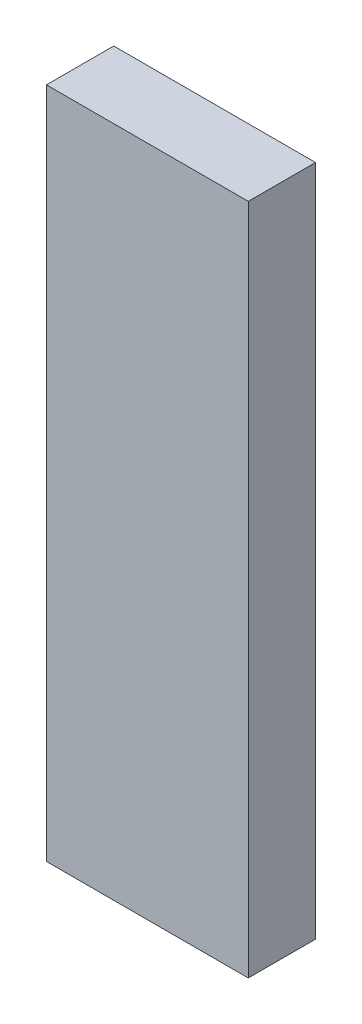
ISO-10303-21;
HEADER;
FILE_DESCRIPTION(('STEP AP214'),'2;1');
FILE_NAME('part.step','',(''),(''),'','','');
FILE_SCHEMA(('AUTOMOTIVE_DESIGN { 1 0 10303 214 1 1 1 1 }'));
ENDSEC;
DATA;
#1=APPLICATION_CONTEXT('core data for automotive mechanical design processes');
#2=APPLICATION_PROTOCOL_DEFINITION('international standard','automotive_design',2000,#1);
#3=PRODUCT_CONTEXT('',#1,'mechanical');
#4=PRODUCT('Part','Part','',(#3));
#5=PRODUCT_RELATED_PRODUCT_CATEGORY('part','',(#4));
#6=PRODUCT_DEFINITION_FORMATION('','',#4);
#7=PRODUCT_DEFINITION_CONTEXT('part definition',#1,'design');
#8=PRODUCT_DEFINITION('design','',#6,#7);
#9=PRODUCT_DEFINITION_SHAPE('','',#8);
#10=(LENGTH_UNIT() NAMED_UNIT(*) SI_UNIT(.MILLI.,.METRE.));
#11=(NAMED_UNIT(*) PLANE_ANGLE_UNIT() SI_UNIT($,.RADIAN.));
#12=(NAMED_UNIT(*) SI_UNIT($,.STERADIAN.) SOLID_ANGLE_UNIT());
#13=UNCERTAINTY_MEASURE_WITH_UNIT(LENGTH_MEASURE(1.E-05),#10,'distance_accuracy_value','');
#14=(GEOMETRIC_REPRESENTATION_CONTEXT(3) GLOBAL_UNCERTAINTY_ASSIGNED_CONTEXT((#13)) GLOBAL_UNIT_ASSIGNED_CONTEXT((#10,
#11,#12)) REPRESENTATION_CONTEXT('',''));
#15=CARTESIAN_POINT('',(0.,0.,0.));
#16=DIRECTION('',(0.,0.,1.));
#17=DIRECTION('',(1.,0.,0.));
#18=AXIS2_PLACEMENT_3D('',#15,#16,#17);
#19=CARTESIAN_POINT('',(-30.,-100.,-10.));
#20=DIRECTION('',(0.,0.,-1.));
#21=DIRECTION('',(-1.,0.,0.));
#22=AXIS2_PLACEMENT_3D('',#19,#20,#21);
#23=PLANE('',#22);
#24=DIRECTION('',(1.,0.,0.));
#25=VECTOR('',#24,1.);
#26=CARTESIAN_POINT('',(-30.,100.,-10.));
#27=LINE('',#26,#25);
#28=CARTESIAN_POINT('',(-30.,100.,-10.));
#29=VERTEX_POINT('',#28);
#30=CARTESIAN_POINT('',(30.,100.,-10.));
#31=VERTEX_POINT('',#30);
#32=EDGE_CURVE('E43',#29,#31,#27,.T.);
#33=ORIENTED_EDGE('',*,*,#32,.T.);
#34=DIRECTION('',(0.,1.,0.));
#35=VECTOR('',#34,1.);
#36=CARTESIAN_POINT('',(30.,-100.,-10.));
#37=LINE('',#36,#35);
#38=CARTESIAN_POINT('',(30.,-100.,-10.));
#39=VERTEX_POINT('',#38);
#40=EDGE_CURVE('E80',#39,#31,#37,.T.);
#41=ORIENTED_EDGE('',*,*,#40,.F.);
#42=DIRECTION('',(1.,0.,0.));
#43=VECTOR('',#42,1.);
#44=CARTESIAN_POINT('',(-30.,-100.,-10.));
#45=LINE('',#44,#43);
#46=CARTESIAN_POINT('',(-30.,-100.,-10.));
#47=VERTEX_POINT('',#46);
#48=EDGE_CURVE('E11',#47,#39,#45,.T.);
#49=ORIENTED_EDGE('',*,*,#48,.F.);
#50=DIRECTION('',(0.,1.,0.));
#51=VECTOR('',#50,1.);
#52=CARTESIAN_POINT('',(-30.,-100.,-10.));
#53=LINE('',#52,#51);
#54=EDGE_CURVE('E81',#47,#29,#53,.T.);
#55=ORIENTED_EDGE('',*,*,#54,.T.);
#56=EDGE_LOOP('',(#33,#41,#49,#55));
#57=FACE_BOUND('',#56,.T.);
#58=ADVANCED_FACE('F40',(#57),#23,.T.);
#59=CARTESIAN_POINT('',(-30.,-100.,10.));
#60=DIRECTION('',(0.,-1.,0.));
#61=DIRECTION('',(0.,0.,-1.));
#62=AXIS2_PLACEMENT_3D('',#59,#60,#61);
#63=PLANE('',#62);
#64=ORIENTED_EDGE('',*,*,#48,.T.);
#65=DIRECTION('',(0.,0.,-1.));
#66=VECTOR('',#65,1.);
#67=CARTESIAN_POINT('',(30.,-100.,10.));
#68=LINE('',#67,#66);
#69=CARTESIAN_POINT('',(30.,-100.,10.));
#70=VERTEX_POINT('',#69);
#71=EDGE_CURVE('E97',#70,#39,#68,.T.);
#72=ORIENTED_EDGE('',*,*,#71,.F.);
#73=DIRECTION('',(1.,0.,0.));
#74=VECTOR('',#73,1.);
#75=CARTESIAN_POINT('',(-30.,-100.,10.));
#76=LINE('',#75,#74);
#77=CARTESIAN_POINT('',(-30.,-100.,10.));
#78=VERTEX_POINT('',#77);
#79=EDGE_CURVE('E48',#78,#70,#76,.T.);
#80=ORIENTED_EDGE('',*,*,#79,.F.);
#81=DIRECTION('',(0.,0.,-1.));
#82=VECTOR('',#81,1.);
#83=CARTESIAN_POINT('',(-30.,-100.,10.));
#84=LINE('',#83,#82);
#85=EDGE_CURVE('E86',#78,#47,#84,.T.);
#86=ORIENTED_EDGE('',*,*,#85,.T.);
#87=EDGE_LOOP('',(#64,#72,#80,#86));
#88=FACE_BOUND('',#87,.T.);
#89=ADVANCED_FACE('F112',(#88),#63,.T.);
#90=CARTESIAN_POINT('',(-30.,-100.,10.));
#91=DIRECTION('',(0.,0.,1.));
#92=DIRECTION('',(1.,0.,0.));
#93=AXIS2_PLACEMENT_3D('',#90,#91,#92);
#94=PLANE('',#93);
#95=ORIENTED_EDGE('',*,*,#79,.T.);
#96=DIRECTION('',(0.,-1.,0.));
#97=VECTOR('',#96,1.);
#98=CARTESIAN_POINT('',(30.,-100.,10.));
#99=LINE('',#98,#97);
#100=CARTESIAN_POINT('',(30.,100.,10.));
#101=VERTEX_POINT('',#100);
#102=EDGE_CURVE('E93',#101,#70,#99,.T.);
#103=ORIENTED_EDGE('',*,*,#102,.F.);
#104=DIRECTION('',(1.,0.,0.));
#105=VECTOR('',#104,1.);
#106=CARTESIAN_POINT('',(-30.,100.,10.));
#107=LINE('',#106,#105);
#108=CARTESIAN_POINT('',(-30.,100.,10.));
#109=VERTEX_POINT('',#108);
#110=EDGE_CURVE('E85',#109,#101,#107,.T.);
#111=ORIENTED_EDGE('',*,*,#110,.F.);
#112=DIRECTION('',(0.,-1.,0.));
#113=VECTOR('',#112,1.);
#114=CARTESIAN_POINT('',(-30.,-100.,10.));
#115=LINE('',#114,#113);
#116=EDGE_CURVE('E105',#109,#78,#115,.T.);
#117=ORIENTED_EDGE('',*,*,#116,.T.);
#118=EDGE_LOOP('',(#95,#103,#111,#117));
#119=FACE_BOUND('',#118,.T.);
#120=ADVANCED_FACE('F109',(#119),#94,.T.);
#121=CARTESIAN_POINT('',(-30.,100.,10.));
#122=DIRECTION('',(0.,1.,0.));
#123=DIRECTION('',(0.,0.,1.));
#124=AXIS2_PLACEMENT_3D('',#121,#122,#123);
#125=PLANE('',#124);
#126=ORIENTED_EDGE('',*,*,#110,.T.);
#127=DIRECTION('',(0.,0.,1.));
#128=VECTOR('',#127,1.);
#129=CARTESIAN_POINT('',(30.,100.,10.));
#130=LINE('',#129,#128);
#131=EDGE_CURVE('E88',#31,#101,#130,.T.);
#132=ORIENTED_EDGE('',*,*,#131,.F.);
#133=ORIENTED_EDGE('',*,*,#32,.F.);
#134=DIRECTION('',(0.,0.,1.));
#135=VECTOR('',#134,1.);
#136=CARTESIAN_POINT('',(-30.,100.,10.));
#137=LINE('',#136,#135);
#138=EDGE_CURVE('E103',#29,#109,#137,.T.);
#139=ORIENTED_EDGE('',*,*,#138,.T.);
#140=EDGE_LOOP('',(#126,#132,#133,#139));
#141=FACE_BOUND('',#140,.T.);
#142=ADVANCED_FACE('F89',(#141),#125,.T.);
#143=CARTESIAN_POINT('',(-30.,0.,0.));
#144=DIRECTION('',(-1.,0.,0.));
#145=DIRECTION('',(0.,0.,1.));
#146=AXIS2_PLACEMENT_3D('',#143,#144,#145);
#147=PLANE('',#146);
#148=ORIENTED_EDGE('',*,*,#54,.F.);
#149=ORIENTED_EDGE('',*,*,#85,.F.);
#150=ORIENTED_EDGE('',*,*,#116,.F.);
#151=ORIENTED_EDGE('',*,*,#138,.F.);
#152=EDGE_LOOP('',(#148,#149,#150,#151));
#153=FACE_BOUND('',#152,.T.);
#154=ADVANCED_FACE('F114',(#153),#147,.T.);
#155=CARTESIAN_POINT('',(30.,0.,0.));
#156=DIRECTION('',(-1.,0.,0.));
#157=DIRECTION('',(0.,0.,1.));
#158=AXIS2_PLACEMENT_3D('',#155,#156,#157);
#159=PLANE('',#158);
#160=ORIENTED_EDGE('',*,*,#40,.T.);
#161=ORIENTED_EDGE('',*,*,#131,.T.);
#162=ORIENTED_EDGE('',*,*,#102,.T.);
#163=ORIENTED_EDGE('',*,*,#71,.T.);
#164=EDGE_LOOP('',(#160,#161,#162,#163));
#165=FACE_BOUND('',#164,.T.);
#166=ADVANCED_FACE('F96',(#165),#159,.F.);
#167=CLOSED_SHELL('',(#58,#89,#120,#142,#154,#166));
#168=MANIFOLD_SOLID_BREP('B2',#167);
#169=ADVANCED_BREP_SHAPE_REPRESENTATION('',(#18,#168),#14);
#170=SHAPE_DEFINITION_REPRESENTATION(#9,#169);
ENDSEC;
END-ISO-10303-21;
